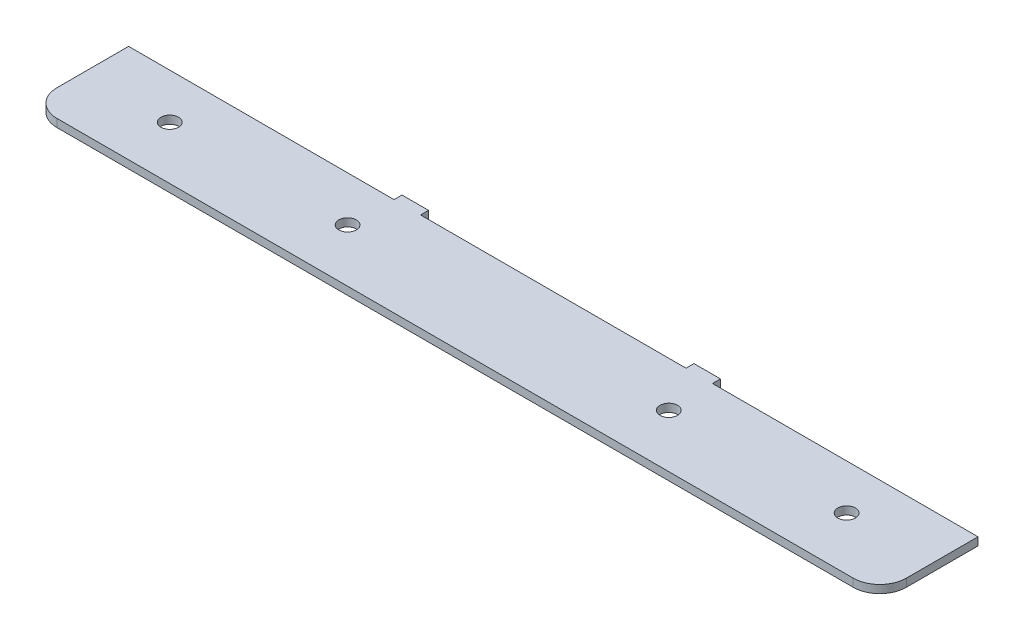
ISO-10303-21;
HEADER;
FILE_DESCRIPTION(('STEP AP214'),'2;1');
FILE_NAME('part.step','',(''),(''),'','','');
FILE_SCHEMA(('AUTOMOTIVE_DESIGN { 1 0 10303 214 1 1 1 1 }'));
ENDSEC;
DATA;
#1=APPLICATION_CONTEXT('core data for automotive mechanical design processes');
#2=APPLICATION_PROTOCOL_DEFINITION('international standard','automotive_design',2000,#1);
#3=PRODUCT_CONTEXT('',#1,'mechanical');
#4=PRODUCT('Part','Part','',(#3));
#5=PRODUCT_RELATED_PRODUCT_CATEGORY('part','',(#4));
#6=PRODUCT_DEFINITION_FORMATION('','',#4);
#7=PRODUCT_DEFINITION_CONTEXT('part definition',#1,'design');
#8=PRODUCT_DEFINITION('design','',#6,#7);
#9=PRODUCT_DEFINITION_SHAPE('','',#8);
#10=(LENGTH_UNIT() NAMED_UNIT(*) SI_UNIT(.MILLI.,.METRE.));
#11=(NAMED_UNIT(*) PLANE_ANGLE_UNIT() SI_UNIT($,.RADIAN.));
#12=(NAMED_UNIT(*) SI_UNIT($,.STERADIAN.) SOLID_ANGLE_UNIT());
#13=UNCERTAINTY_MEASURE_WITH_UNIT(LENGTH_MEASURE(1.E-05),#10,'distance_accuracy_value','');
#14=(GEOMETRIC_REPRESENTATION_CONTEXT(3) GLOBAL_UNCERTAINTY_ASSIGNED_CONTEXT((#13)) GLOBAL_UNIT_ASSIGNED_CONTEXT((#10,
#11,#12)) REPRESENTATION_CONTEXT('',''));
#15=CARTESIAN_POINT('',(0.,0.,0.));
#16=DIRECTION('',(0.,0.,1.));
#17=DIRECTION('',(1.,0.,0.));
#18=AXIS2_PLACEMENT_3D('',#15,#16,#17);
#19=CARTESIAN_POINT('',(-738.924593218809,901.500000000005,-669.000000000004));
#20=DIRECTION('',(0.,0.,1.));
#21=DIRECTION('',(1.,0.,0.));
#22=AXIS2_PLACEMENT_3D('',#19,#20,#21);
#23=PLANE('',#22);
#24=DIRECTION('',(-1.,0.,0.));
#25=VECTOR('',#24,1.);
#26=CARTESIAN_POINT('',(0.,898.5,-669.));
#27=LINE('',#26,#25);
#28=CARTESIAN_POINT('',(25.,898.5,-669.));
#29=VERTEX_POINT('',#28);
#30=CARTESIAN_POINT('',(-25.,898.5,-669.));
#31=VERTEX_POINT('',#30);
#32=EDGE_CURVE('E62',#29,#31,#27,.T.);
#33=ORIENTED_EDGE('',*,*,#32,.F.);
#34=DIRECTION('',(0.,-1.,0.));
#35=VECTOR('',#34,1.);
#36=CARTESIAN_POINT('',(25.,898.5,-669.));
#37=LINE('',#36,#35);
#38=CARTESIAN_POINT('',(25.,897.,-669.));
#39=VERTEX_POINT('',#38);
#40=EDGE_CURVE('E194',#29,#39,#37,.T.);
#41=ORIENTED_EDGE('',*,*,#40,.T.);
#42=DIRECTION('',(-1.,0.,0.));
#43=VECTOR('',#42,1.);
#44=CARTESIAN_POINT('',(0.,897.,-669.000000000004));
#45=LINE('',#44,#43);
#46=CARTESIAN_POINT('',(-25.,897.,-669.));
#47=VERTEX_POINT('',#46);
#48=EDGE_CURVE('E50',#39,#47,#45,.T.);
#49=ORIENTED_EDGE('',*,*,#48,.T.);
#50=DIRECTION('',(0.,-1.,0.));
#51=VECTOR('',#50,1.);
#52=CARTESIAN_POINT('',(-25.,898.5,-669.));
#53=LINE('',#52,#51);
#54=EDGE_CURVE('E230',#31,#47,#53,.T.);
#55=ORIENTED_EDGE('',*,*,#54,.F.);
#56=EDGE_LOOP('',(#33,#41,#49,#55));
#57=FACE_BOUND('',#56,.T.);
#58=ADVANCED_FACE('F42',(#57),#23,.F.);
#59=CARTESIAN_POINT('',(80.,897.,-669.));
#60=VERTEX_POINT('',#59);
#61=CARTESIAN_POINT('',(30.,897.,-669.000000000004));
#62=VERTEX_POINT('',#61);
#63=EDGE_CURVE('E11',#60,#62,#45,.T.);
#64=ORIENTED_EDGE('',*,*,#63,.T.);
#65=DIRECTION('',(0.,-1.,0.));
#66=VECTOR('',#65,1.);
#67=CARTESIAN_POINT('',(30.,898.5,-669.));
#68=LINE('',#67,#66);
#69=CARTESIAN_POINT('',(30.,898.5,-669.));
#70=VERTEX_POINT('',#69);
#71=EDGE_CURVE('E72',#70,#62,#68,.T.);
#72=ORIENTED_EDGE('',*,*,#71,.F.);
#73=CARTESIAN_POINT('',(80.,898.5,-669.));
#74=VERTEX_POINT('',#73);
#75=EDGE_CURVE('E236',#74,#70,#27,.T.);
#76=ORIENTED_EDGE('',*,*,#75,.F.);
#77=DIRECTION('',(0.,1.,0.));
#78=VECTOR('',#77,1.);
#79=CARTESIAN_POINT('',(80.,0.,-669.));
#80=LINE('',#79,#78);
#81=EDGE_CURVE('E282',#60,#74,#80,.T.);
#82=ORIENTED_EDGE('',*,*,#81,.F.);
#83=EDGE_LOOP('',(#64,#72,#76,#82));
#84=FACE_BOUND('',#83,.T.);
#85=ADVANCED_FACE('F351',(#84),#23,.F.);
#86=CARTESIAN_POINT('',(-30.,898.5,-669.));
#87=VERTEX_POINT('',#86);
#88=CARTESIAN_POINT('',(-80.,898.5,-669.));
#89=VERTEX_POINT('',#88);
#90=EDGE_CURVE('E239',#87,#89,#27,.T.);
#91=ORIENTED_EDGE('',*,*,#90,.F.);
#92=DIRECTION('',(0.,-1.,0.));
#93=VECTOR('',#92,1.);
#94=CARTESIAN_POINT('',(-30.,898.5,-669.));
#95=LINE('',#94,#93);
#96=CARTESIAN_POINT('',(-30.,897.,-669.000000000004));
#97=VERTEX_POINT('',#96);
#98=EDGE_CURVE('E226',#87,#97,#95,.T.);
#99=ORIENTED_EDGE('',*,*,#98,.T.);
#100=CARTESIAN_POINT('',(-80.,897.,-669.));
#101=VERTEX_POINT('',#100);
#102=EDGE_CURVE('E51',#97,#101,#45,.T.);
#103=ORIENTED_EDGE('',*,*,#102,.T.);
#104=DIRECTION('',(0.,1.,0.));
#105=VECTOR('',#104,1.);
#106=CARTESIAN_POINT('',(-80.,0.,-669.));
#107=LINE('',#106,#105);
#108=EDGE_CURVE('E229',#89,#101,#107,.F.);
#109=ORIENTED_EDGE('',*,*,#108,.F.);
#110=EDGE_LOOP('',(#91,#99,#103,#109));
#111=FACE_BOUND('',#110,.T.);
#112=ADVANCED_FACE('F44',(#111),#23,.F.);
#113=CARTESIAN_POINT('',(-75.,897.,-655.5));
#114=DIRECTION('',(0.,1.,0.));
#115=DIRECTION('',(0.,0.,1.));
#116=AXIS2_PLACEMENT_3D('',#113,#114,#115);
#117=CYLINDRICAL_SURFACE('',#116,5.);
#118=CARTESIAN_POINT('',(-75.,897.,-655.5));
#119=DIRECTION('',(0.,1.,0.));
#120=DIRECTION('',(0.,0.,1.));
#121=AXIS2_PLACEMENT_3D('',#118,#119,#120);
#122=CIRCLE('',#121,5.);
#123=CARTESIAN_POINT('',(-75.,897.,-650.5));
#124=VERTEX_POINT('',#123);
#125=CARTESIAN_POINT('',(-80.,897.,-655.5));
#126=VERTEX_POINT('',#125);
#127=EDGE_CURVE('E261',#124,#126,#122,.F.);
#128=ORIENTED_EDGE('',*,*,#127,.F.);
#129=DIRECTION('',(0.,1.,0.));
#130=VECTOR('',#129,1.);
#131=CARTESIAN_POINT('',(-75.,897.,-650.5));
#132=LINE('',#131,#130);
#133=CARTESIAN_POINT('',(-75.,898.5,-650.5));
#134=VERTEX_POINT('',#133);
#135=EDGE_CURVE('E243',#124,#134,#132,.T.);
#136=ORIENTED_EDGE('',*,*,#135,.T.);
#137=CARTESIAN_POINT('',(-75.,898.5,-655.5));
#138=DIRECTION('',(0.,1.,0.));
#139=DIRECTION('',(0.,0.,1.));
#140=AXIS2_PLACEMENT_3D('',#137,#138,#139);
#141=CIRCLE('',#140,5.);
#142=CARTESIAN_POINT('',(-80.,898.5,-655.5));
#143=VERTEX_POINT('',#142);
#144=EDGE_CURVE('E240',#134,#143,#141,.F.);
#145=ORIENTED_EDGE('',*,*,#144,.T.);
#146=DIRECTION('',(0.,1.,0.));
#147=VECTOR('',#146,1.);
#148=CARTESIAN_POINT('',(-80.,899.2366,-655.5));
#149=LINE('',#148,#147);
#150=EDGE_CURVE('E287',#126,#143,#149,.T.);
#151=ORIENTED_EDGE('',*,*,#150,.F.);
#152=EDGE_LOOP('',(#128,#136,#145,#151));
#153=FACE_BOUND('',#152,.T.);
#154=ADVANCED_FACE('F323',(#153),#117,.T.);
#155=CARTESIAN_POINT('',(80.,897.,-650.5));
#156=DIRECTION('',(0.,0.,1.));
#157=DIRECTION('',(0.,-1.,0.));
#158=AXIS2_PLACEMENT_3D('',#155,#156,#157);
#159=PLANE('',#158);
#160=DIRECTION('',(1.,0.,0.));
#161=VECTOR('',#160,1.);
#162=CARTESIAN_POINT('',(80.,898.5,-650.5));
#163=LINE('',#162,#161);
#164=CARTESIAN_POINT('',(75.,898.5,-650.5));
#165=VERTEX_POINT('',#164);
#166=EDGE_CURVE('E242',#165,#134,#163,.F.);
#167=ORIENTED_EDGE('',*,*,#166,.T.);
#168=ORIENTED_EDGE('',*,*,#135,.F.);
#169=DIRECTION('',(1.,0.,0.));
#170=VECTOR('',#169,1.);
#171=CARTESIAN_POINT('',(0.,897.,-650.5));
#172=LINE('',#171,#170);
#173=CARTESIAN_POINT('',(75.,897.,-650.5));
#174=VERTEX_POINT('',#173);
#175=EDGE_CURVE('E264',#174,#124,#172,.F.);
#176=ORIENTED_EDGE('',*,*,#175,.F.);
#177=DIRECTION('',(0.,1.,0.));
#178=VECTOR('',#177,1.);
#179=CARTESIAN_POINT('',(75.,897.,-650.5));
#180=LINE('',#179,#178);
#181=EDGE_CURVE('E247',#165,#174,#180,.F.);
#182=ORIENTED_EDGE('',*,*,#181,.F.);
#183=EDGE_LOOP('',(#167,#168,#176,#182));
#184=FACE_BOUND('',#183,.T.);
#185=ADVANCED_FACE('F318',(#184),#159,.T.);
#186=CARTESIAN_POINT('',(75.,897.,-655.5));
#187=DIRECTION('',(0.,1.,0.));
#188=DIRECTION('',(0.,0.,1.));
#189=AXIS2_PLACEMENT_3D('',#186,#187,#188);
#190=CYLINDRICAL_SURFACE('',#189,5.);
#191=CARTESIAN_POINT('',(75.,897.,-655.5));
#192=DIRECTION('',(0.,1.,0.));
#193=DIRECTION('',(0.,0.,1.));
#194=AXIS2_PLACEMENT_3D('',#191,#192,#193);
#195=CIRCLE('',#194,5.);
#196=CARTESIAN_POINT('',(80.,897.,-655.5));
#197=VERTEX_POINT('',#196);
#198=EDGE_CURVE('E266',#197,#174,#195,.F.);
#199=ORIENTED_EDGE('',*,*,#198,.F.);
#200=DIRECTION('',(0.,1.,0.));
#201=VECTOR('',#200,1.);
#202=CARTESIAN_POINT('',(80.,899.2366,-655.5));
#203=LINE('',#202,#201);
#204=CARTESIAN_POINT('',(80.,898.5,-655.5));
#205=VERTEX_POINT('',#204);
#206=EDGE_CURVE('E238',#197,#205,#203,.T.);
#207=ORIENTED_EDGE('',*,*,#206,.T.);
#208=CARTESIAN_POINT('',(75.,898.5,-655.5));
#209=DIRECTION('',(0.,1.,0.));
#210=DIRECTION('',(0.,0.,1.));
#211=AXIS2_PLACEMENT_3D('',#208,#209,#210);
#212=CIRCLE('',#211,5.);
#213=EDGE_CURVE('E244',#205,#165,#212,.F.);
#214=ORIENTED_EDGE('',*,*,#213,.T.);
#215=ORIENTED_EDGE('',*,*,#181,.T.);
#216=EDGE_LOOP('',(#199,#207,#214,#215));
#217=FACE_BOUND('',#216,.T.);
#218=ADVANCED_FACE('F315',(#217),#190,.T.);
#219=CARTESIAN_POINT('',(30.25,897.,-660.5));
#220=DIRECTION('',(0.,-1.,0.));
#221=DIRECTION('',(0.,0.,-1.));
#222=AXIS2_PLACEMENT_3D('',#219,#220,#221);
#223=CYLINDRICAL_SURFACE('',#222,1.65000000000004);
#224=CARTESIAN_POINT('',(30.25,898.5,-660.5));
#225=DIRECTION('',(0.,-1.,0.));
#226=DIRECTION('',(0.,0.,-1.));
#227=AXIS2_PLACEMENT_3D('',#224,#225,#226);
#228=CIRCLE('',#227,1.65000000000004);
#229=CARTESIAN_POINT('',(30.25,898.5,-662.15));
#230=VERTEX_POINT('',#229);
#231=EDGE_CURVE('E248',#230,#230,#228,.T.);
#232=ORIENTED_EDGE('',*,*,#231,.F.);
#233=EDGE_LOOP('',(#232));
#234=FACE_BOUND('',#233,.T.);
#235=CARTESIAN_POINT('',(30.25,897.,-660.5));
#236=DIRECTION('',(0.,-1.,0.));
#237=DIRECTION('',(0.,0.,-1.));
#238=AXIS2_PLACEMENT_3D('',#235,#236,#237);
#239=CIRCLE('',#238,1.65000000000004);
#240=CARTESIAN_POINT('',(30.25,897.,-662.15));
#241=VERTEX_POINT('',#240);
#242=EDGE_CURVE('E270',#241,#241,#239,.F.);
#243=ORIENTED_EDGE('',*,*,#242,.F.);
#244=EDGE_LOOP('',(#243));
#245=FACE_BOUND('',#244,.T.);
#246=ADVANCED_FACE('F368',(#234,#245),#223,.F.);
#247=CARTESIAN_POINT('',(63.75,897.,-660.5));
#248=DIRECTION('',(0.,-1.,0.));
#249=DIRECTION('',(0.,0.,-1.));
#250=AXIS2_PLACEMENT_3D('',#247,#248,#249);
#251=CYLINDRICAL_SURFACE('',#250,1.64999999999993);
#252=CARTESIAN_POINT('',(63.75,898.5,-660.5));
#253=DIRECTION('',(0.,-1.,0.));
#254=DIRECTION('',(0.,0.,-1.));
#255=AXIS2_PLACEMENT_3D('',#252,#253,#254);
#256=CIRCLE('',#255,1.64999999999993);
#257=CARTESIAN_POINT('',(63.75,898.5,-662.15));
#258=VERTEX_POINT('',#257);
#259=EDGE_CURVE('E251',#258,#258,#256,.T.);
#260=ORIENTED_EDGE('',*,*,#259,.F.);
#261=EDGE_LOOP('',(#260));
#262=FACE_BOUND('',#261,.T.);
#263=CARTESIAN_POINT('',(63.75,897.,-660.5));
#264=DIRECTION('',(0.,-1.,0.));
#265=DIRECTION('',(0.,0.,-1.));
#266=AXIS2_PLACEMENT_3D('',#263,#264,#265);
#267=CIRCLE('',#266,1.64999999999993);
#268=CARTESIAN_POINT('',(63.75,897.,-662.15));
#269=VERTEX_POINT('',#268);
#270=EDGE_CURVE('E273',#269,#269,#267,.F.);
#271=ORIENTED_EDGE('',*,*,#270,.F.);
#272=EDGE_LOOP('',(#271));
#273=FACE_BOUND('',#272,.T.);
#274=ADVANCED_FACE('F371',(#262,#273),#251,.F.);
#275=CARTESIAN_POINT('',(-30.25,897.,-660.5));
#276=DIRECTION('',(0.,-1.,0.));
#277=DIRECTION('',(0.,0.,-1.));
#278=AXIS2_PLACEMENT_3D('',#275,#276,#277);
#279=CYLINDRICAL_SURFACE('',#278,1.65000000000004);
#280=CARTESIAN_POINT('',(-30.25,898.5,-660.5));
#281=DIRECTION('',(0.,-1.,0.));
#282=DIRECTION('',(0.,0.,-1.));
#283=AXIS2_PLACEMENT_3D('',#280,#281,#282);
#284=CIRCLE('',#283,1.65000000000004);
#285=CARTESIAN_POINT('',(-30.25,898.5,-662.15));
#286=VERTEX_POINT('',#285);
#287=EDGE_CURVE('E254',#286,#286,#284,.T.);
#288=ORIENTED_EDGE('',*,*,#287,.F.);
#289=EDGE_LOOP('',(#288));
#290=FACE_BOUND('',#289,.T.);
#291=CARTESIAN_POINT('',(-30.25,897.,-660.5));
#292=DIRECTION('',(0.,-1.,0.));
#293=DIRECTION('',(0.,0.,-1.));
#294=AXIS2_PLACEMENT_3D('',#291,#292,#293);
#295=CIRCLE('',#294,1.65000000000004);
#296=CARTESIAN_POINT('',(-30.25,897.,-662.15));
#297=VERTEX_POINT('',#296);
#298=EDGE_CURVE('E276',#297,#297,#295,.F.);
#299=ORIENTED_EDGE('',*,*,#298,.F.);
#300=EDGE_LOOP('',(#299));
#301=FACE_BOUND('',#300,.T.);
#302=ADVANCED_FACE('F375',(#290,#301),#279,.F.);
#303=CARTESIAN_POINT('',(-63.75,897.,-660.5));
#304=DIRECTION('',(0.,-1.,0.));
#305=DIRECTION('',(0.,0.,-1.));
#306=AXIS2_PLACEMENT_3D('',#303,#304,#305);
#307=CYLINDRICAL_SURFACE('',#306,1.65000000000004);
#308=CARTESIAN_POINT('',(-63.75,898.5,-660.5));
#309=DIRECTION('',(0.,-1.,0.));
#310=DIRECTION('',(0.,0.,-1.));
#311=AXIS2_PLACEMENT_3D('',#308,#309,#310);
#312=CIRCLE('',#311,1.65000000000004);
#313=CARTESIAN_POINT('',(-63.75,898.5,-662.15));
#314=VERTEX_POINT('',#313);
#315=EDGE_CURVE('E257',#314,#314,#312,.T.);
#316=ORIENTED_EDGE('',*,*,#315,.F.);
#317=EDGE_LOOP('',(#316));
#318=FACE_BOUND('',#317,.T.);
#319=CARTESIAN_POINT('',(-63.75,897.,-660.5));
#320=DIRECTION('',(0.,-1.,0.));
#321=DIRECTION('',(0.,0.,-1.));
#322=AXIS2_PLACEMENT_3D('',#319,#320,#321);
#323=CIRCLE('',#322,1.65000000000004);
#324=CARTESIAN_POINT('',(-63.75,897.,-662.15));
#325=VERTEX_POINT('',#324);
#326=EDGE_CURVE('E279',#325,#325,#323,.F.);
#327=ORIENTED_EDGE('',*,*,#326,.F.);
#328=EDGE_LOOP('',(#327));
#329=FACE_BOUND('',#328,.T.);
#330=ADVANCED_FACE('F379',(#318,#329),#307,.F.);
#331=CARTESIAN_POINT('',(80.,899.2366,-668.2634));
#332=DIRECTION('',(-1.,0.,0.));
#333=DIRECTION('',(0.,0.,1.));
#334=AXIS2_PLACEMENT_3D('',#331,#332,#333);
#335=PLANE('',#334);
#336=DIRECTION('',(0.,0.,-1.));
#337=VECTOR('',#336,1.);
#338=CARTESIAN_POINT('',(80.,896.999999999996,5.44009282066327E-12));
#339=LINE('',#338,#337);
#340=EDGE_CURVE('E269',#60,#197,#339,.F.);
#341=ORIENTED_EDGE('',*,*,#340,.F.);
#342=ORIENTED_EDGE('',*,*,#81,.T.);
#343=DIRECTION('',(0.,0.,1.));
#344=VECTOR('',#343,1.);
#345=CARTESIAN_POINT('',(80.,898.5,-668.2634));
#346=LINE('',#345,#344);
#347=EDGE_CURVE('E260',#205,#74,#346,.F.);
#348=ORIENTED_EDGE('',*,*,#347,.F.);
#349=ORIENTED_EDGE('',*,*,#206,.F.);
#350=EDGE_LOOP('',(#341,#342,#348,#349));
#351=FACE_BOUND('',#350,.T.);
#352=ADVANCED_FACE('F312',(#351),#335,.F.);
#353=CARTESIAN_POINT('',(0.,898.499999999996,5.44009282066327E-12));
#354=DIRECTION('',(0.,-1.,0.));
#355=DIRECTION('',(0.,0.,-1.));
#356=AXIS2_PLACEMENT_3D('',#353,#354,#355);
#357=PLANE('',#356);
#358=ORIENTED_EDGE('',*,*,#315,.T.);
#359=EDGE_LOOP('',(#358));
#360=FACE_BOUND('',#359,.T.);
#361=ORIENTED_EDGE('',*,*,#287,.T.);
#362=EDGE_LOOP('',(#361));
#363=FACE_BOUND('',#362,.T.);
#364=ORIENTED_EDGE('',*,*,#259,.T.);
#365=EDGE_LOOP('',(#364));
#366=FACE_BOUND('',#365,.T.);
#367=ORIENTED_EDGE('',*,*,#231,.T.);
#368=EDGE_LOOP('',(#367));
#369=FACE_BOUND('',#368,.T.);
#370=ORIENTED_EDGE('',*,*,#347,.T.);
#371=ORIENTED_EDGE('',*,*,#75,.T.);
#372=DIRECTION('',(0.,0.,1.));
#373=VECTOR('',#372,1.);
#374=CARTESIAN_POINT('',(30.,898.5,-669.));
#375=LINE('',#374,#373);
#376=CARTESIAN_POINT('',(30.,898.5,-670.5));
#377=VERTEX_POINT('',#376);
#378=EDGE_CURVE('E183',#377,#70,#375,.T.);
#379=ORIENTED_EDGE('',*,*,#378,.F.);
#380=DIRECTION('',(1.,0.,0.));
#381=VECTOR('',#380,1.);
#382=CARTESIAN_POINT('',(25.,898.5,-670.5));
#383=LINE('',#382,#381);
#384=CARTESIAN_POINT('',(25.,898.5,-670.5));
#385=VERTEX_POINT('',#384);
#386=EDGE_CURVE('E175',#385,#377,#383,.T.);
#387=ORIENTED_EDGE('',*,*,#386,.F.);
#388=DIRECTION('',(0.,0.,-1.));
#389=VECTOR('',#388,1.);
#390=CARTESIAN_POINT('',(25.,898.5,-669.));
#391=LINE('',#390,#389);
#392=EDGE_CURVE('E190',#29,#385,#391,.T.);
#393=ORIENTED_EDGE('',*,*,#392,.F.);
#394=ORIENTED_EDGE('',*,*,#32,.T.);
#395=DIRECTION('',(0.,0.,1.));
#396=VECTOR('',#395,1.);
#397=CARTESIAN_POINT('',(-25.,898.5,-669.));
#398=LINE('',#397,#396);
#399=CARTESIAN_POINT('',(-25.,898.5,-670.5));
#400=VERTEX_POINT('',#399);
#401=EDGE_CURVE('E215',#400,#31,#398,.T.);
#402=ORIENTED_EDGE('',*,*,#401,.F.);
#403=DIRECTION('',(1.,0.,0.));
#404=VECTOR('',#403,1.);
#405=CARTESIAN_POINT('',(-30.,898.5,-670.5));
#406=LINE('',#405,#404);
#407=CARTESIAN_POINT('',(-30.,898.5,-670.5));
#408=VERTEX_POINT('',#407);
#409=EDGE_CURVE('E211',#408,#400,#406,.T.);
#410=ORIENTED_EDGE('',*,*,#409,.F.);
#411=DIRECTION('',(0.,0.,-1.));
#412=VECTOR('',#411,1.);
#413=CARTESIAN_POINT('',(-30.,898.5,-669.));
#414=LINE('',#413,#412);
#415=EDGE_CURVE('E208',#87,#408,#414,.T.);
#416=ORIENTED_EDGE('',*,*,#415,.F.);
#417=ORIENTED_EDGE('',*,*,#90,.T.);
#418=DIRECTION('',(0.,0.,1.));
#419=VECTOR('',#418,1.);
#420=CARTESIAN_POINT('',(-80.,898.5,-668.2634));
#421=LINE('',#420,#419);
#422=EDGE_CURVE('E290',#143,#89,#421,.F.);
#423=ORIENTED_EDGE('',*,*,#422,.F.);
#424=ORIENTED_EDGE('',*,*,#144,.F.);
#425=ORIENTED_EDGE('',*,*,#166,.F.);
#426=ORIENTED_EDGE('',*,*,#213,.F.);
#427=EDGE_LOOP('',(#370,#371,#379,#387,#393,#394,#402,#410,#416,#417,#423,#424,#425,#426));
#428=FACE_BOUND('',#427,.T.);
#429=ADVANCED_FACE('F189',(#360,#363,#366,#369,#428),#357,.F.);
#430=CARTESIAN_POINT('',(-80.,899.2366,-668.2634));
#431=DIRECTION('',(-1.,0.,0.));
#432=DIRECTION('',(0.,0.,1.));
#433=AXIS2_PLACEMENT_3D('',#430,#431,#432);
#434=PLANE('',#433);
#435=ORIENTED_EDGE('',*,*,#108,.T.);
#436=DIRECTION('',(0.,0.,-1.));
#437=VECTOR('',#436,1.);
#438=CARTESIAN_POINT('',(-80.,896.999999999996,5.44009282066327E-12));
#439=LINE('',#438,#437);
#440=EDGE_CURVE('E265',#126,#101,#439,.T.);
#441=ORIENTED_EDGE('',*,*,#440,.F.);
#442=ORIENTED_EDGE('',*,*,#150,.T.);
#443=ORIENTED_EDGE('',*,*,#422,.T.);
#444=EDGE_LOOP('',(#435,#441,#442,#443));
#445=FACE_BOUND('',#444,.T.);
#446=ADVANCED_FACE('F326',(#445),#434,.T.);
#447=CARTESIAN_POINT('',(0.,896.999999999996,5.44009282066327E-12));
#448=DIRECTION('',(0.,-1.,0.));
#449=DIRECTION('',(0.,0.,-1.));
#450=AXIS2_PLACEMENT_3D('',#447,#448,#449);
#451=PLANE('',#450);
#452=ORIENTED_EDGE('',*,*,#63,.F.);
#453=ORIENTED_EDGE('',*,*,#340,.T.);
#454=ORIENTED_EDGE('',*,*,#198,.T.);
#455=ORIENTED_EDGE('',*,*,#175,.T.);
#456=ORIENTED_EDGE('',*,*,#127,.T.);
#457=ORIENTED_EDGE('',*,*,#440,.T.);
#458=ORIENTED_EDGE('',*,*,#102,.F.);
#459=DIRECTION('',(0.,0.,-1.));
#460=VECTOR('',#459,1.);
#461=CARTESIAN_POINT('',(-30.,897.,-669.));
#462=LINE('',#461,#460);
#463=CARTESIAN_POINT('',(-30.,897.,-670.5));
#464=VERTEX_POINT('',#463);
#465=EDGE_CURVE('E205',#97,#464,#462,.T.);
#466=ORIENTED_EDGE('',*,*,#465,.T.);
#467=DIRECTION('',(1.,0.,0.));
#468=VECTOR('',#467,1.);
#469=CARTESIAN_POINT('',(-30.,897.,-670.5));
#470=LINE('',#469,#468);
#471=CARTESIAN_POINT('',(-25.,897.,-670.5));
#472=VERTEX_POINT('',#471);
#473=EDGE_CURVE('E221',#464,#472,#470,.T.);
#474=ORIENTED_EDGE('',*,*,#473,.T.);
#475=DIRECTION('',(0.,0.,1.));
#476=VECTOR('',#475,1.);
#477=CARTESIAN_POINT('',(-25.,897.,-669.));
#478=LINE('',#477,#476);
#479=EDGE_CURVE('E212',#472,#47,#478,.T.);
#480=ORIENTED_EDGE('',*,*,#479,.T.);
#481=ORIENTED_EDGE('',*,*,#48,.F.);
#482=DIRECTION('',(0.,0.,-1.));
#483=VECTOR('',#482,1.);
#484=CARTESIAN_POINT('',(25.,897.,-669.));
#485=LINE('',#484,#483);
#486=CARTESIAN_POINT('',(25.,897.,-670.5));
#487=VERTEX_POINT('',#486);
#488=EDGE_CURVE('E201',#39,#487,#485,.T.);
#489=ORIENTED_EDGE('',*,*,#488,.T.);
#490=DIRECTION('',(1.,0.,0.));
#491=VECTOR('',#490,1.);
#492=CARTESIAN_POINT('',(25.,897.,-670.5));
#493=LINE('',#492,#491);
#494=CARTESIAN_POINT('',(30.,897.,-670.5));
#495=VERTEX_POINT('',#494);
#496=EDGE_CURVE('E177',#487,#495,#493,.T.);
#497=ORIENTED_EDGE('',*,*,#496,.T.);
#498=DIRECTION('',(0.,0.,1.));
#499=VECTOR('',#498,1.);
#500=CARTESIAN_POINT('',(30.,897.,-669.));
#501=LINE('',#500,#499);
#502=EDGE_CURVE('E195',#495,#62,#501,.T.);
#503=ORIENTED_EDGE('',*,*,#502,.T.);
#504=EDGE_LOOP('',(#452,#453,#454,#455,#456,#457,#458,#466,#474,#480,#481,#489,#497,#503));
#505=FACE_BOUND('',#504,.T.);
#506=ORIENTED_EDGE('',*,*,#326,.T.);
#507=EDGE_LOOP('',(#506));
#508=FACE_BOUND('',#507,.T.);
#509=ORIENTED_EDGE('',*,*,#298,.T.);
#510=EDGE_LOOP('',(#509));
#511=FACE_BOUND('',#510,.T.);
#512=ORIENTED_EDGE('',*,*,#270,.T.);
#513=EDGE_LOOP('',(#512));
#514=FACE_BOUND('',#513,.T.);
#515=ORIENTED_EDGE('',*,*,#242,.T.);
#516=EDGE_LOOP('',(#515));
#517=FACE_BOUND('',#516,.T.);
#518=ADVANCED_FACE('F308',(#505,#508,#511,#514,#517),#451,.T.);
#519=CARTESIAN_POINT('',(-30.,898.5,-669.));
#520=DIRECTION('',(-1.,0.,0.));
#521=DIRECTION('',(0.,0.,1.));
#522=AXIS2_PLACEMENT_3D('',#519,#520,#521);
#523=PLANE('',#522);
#524=ORIENTED_EDGE('',*,*,#465,.F.);
#525=ORIENTED_EDGE('',*,*,#98,.F.);
#526=ORIENTED_EDGE('',*,*,#415,.T.);
#527=DIRECTION('',(0.,-1.,0.));
#528=VECTOR('',#527,1.);
#529=CARTESIAN_POINT('',(-30.,898.5,-670.5));
#530=LINE('',#529,#528);
#531=EDGE_CURVE('E218',#408,#464,#530,.T.);
#532=ORIENTED_EDGE('',*,*,#531,.T.);
#533=EDGE_LOOP('',(#524,#525,#526,#532));
#534=FACE_BOUND('',#533,.T.);
#535=ADVANCED_FACE('F340',(#534),#523,.T.);
#536=CARTESIAN_POINT('',(-25.,898.5,-669.));
#537=DIRECTION('',(1.,0.,0.));
#538=DIRECTION('',(0.,0.,-1.));
#539=AXIS2_PLACEMENT_3D('',#536,#537,#538);
#540=PLANE('',#539);
#541=ORIENTED_EDGE('',*,*,#479,.F.);
#542=DIRECTION('',(0.,-1.,0.));
#543=VECTOR('',#542,1.);
#544=CARTESIAN_POINT('',(-25.,898.5,-670.5));
#545=LINE('',#544,#543);
#546=EDGE_CURVE('E233',#400,#472,#545,.T.);
#547=ORIENTED_EDGE('',*,*,#546,.F.);
#548=ORIENTED_EDGE('',*,*,#401,.T.);
#549=ORIENTED_EDGE('',*,*,#54,.T.);
#550=EDGE_LOOP('',(#541,#547,#548,#549));
#551=FACE_BOUND('',#550,.T.);
#552=ADVANCED_FACE('F332',(#551),#540,.T.);
#553=CARTESIAN_POINT('',(-30.,898.5,-670.5));
#554=DIRECTION('',(0.,0.,-1.));
#555=DIRECTION('',(0.,1.,0.));
#556=AXIS2_PLACEMENT_3D('',#553,#554,#555);
#557=PLANE('',#556);
#558=ORIENTED_EDGE('',*,*,#473,.F.);
#559=ORIENTED_EDGE('',*,*,#531,.F.);
#560=ORIENTED_EDGE('',*,*,#409,.T.);
#561=ORIENTED_EDGE('',*,*,#546,.T.);
#562=EDGE_LOOP('',(#558,#559,#560,#561));
#563=FACE_BOUND('',#562,.T.);
#564=ADVANCED_FACE('F336',(#563),#557,.T.);
#565=CARTESIAN_POINT('',(25.,898.5,-669.));
#566=DIRECTION('',(-1.,0.,0.));
#567=DIRECTION('',(0.,0.,1.));
#568=AXIS2_PLACEMENT_3D('',#565,#566,#567);
#569=PLANE('',#568);
#570=ORIENTED_EDGE('',*,*,#488,.F.);
#571=ORIENTED_EDGE('',*,*,#40,.F.);
#572=ORIENTED_EDGE('',*,*,#392,.T.);
#573=DIRECTION('',(0.,-1.,0.));
#574=VECTOR('',#573,1.);
#575=CARTESIAN_POINT('',(25.,898.5,-670.5));
#576=LINE('',#575,#574);
#577=EDGE_CURVE('E172',#385,#487,#576,.T.);
#578=ORIENTED_EDGE('',*,*,#577,.T.);
#579=EDGE_LOOP('',(#570,#571,#572,#578));
#580=FACE_BOUND('',#579,.T.);
#581=ADVANCED_FACE('F193',(#580),#569,.T.);
#582=CARTESIAN_POINT('',(30.,898.5,-669.));
#583=DIRECTION('',(1.,0.,0.));
#584=DIRECTION('',(0.,0.,-1.));
#585=AXIS2_PLACEMENT_3D('',#582,#583,#584);
#586=PLANE('',#585);
#587=ORIENTED_EDGE('',*,*,#502,.F.);
#588=DIRECTION('',(0.,-1.,0.));
#589=VECTOR('',#588,1.);
#590=CARTESIAN_POINT('',(30.,898.5,-670.5));
#591=LINE('',#590,#589);
#592=EDGE_CURVE('E182',#377,#495,#591,.T.);
#593=ORIENTED_EDGE('',*,*,#592,.F.);
#594=ORIENTED_EDGE('',*,*,#378,.T.);
#595=ORIENTED_EDGE('',*,*,#71,.T.);
#596=EDGE_LOOP('',(#587,#593,#594,#595));
#597=FACE_BOUND('',#596,.T.);
#598=ADVANCED_FACE('F484',(#597),#586,.T.);
#599=CARTESIAN_POINT('',(25.,898.5,-670.5));
#600=DIRECTION('',(0.,0.,-1.));
#601=DIRECTION('',(0.,1.,0.));
#602=AXIS2_PLACEMENT_3D('',#599,#600,#601);
#603=PLANE('',#602);
#604=ORIENTED_EDGE('',*,*,#496,.F.);
#605=ORIENTED_EDGE('',*,*,#577,.F.);
#606=ORIENTED_EDGE('',*,*,#386,.T.);
#607=ORIENTED_EDGE('',*,*,#592,.T.);
#608=EDGE_LOOP('',(#604,#605,#606,#607));
#609=FACE_BOUND('',#608,.T.);
#610=ADVANCED_FACE('F174',(#609),#603,.T.);
#611=CLOSED_SHELL('',(#58,#85,#112,#154,#185,#218,#246,#274,#302,#330,#352,#429,#446,#518,#535,
#552,#564,#581,#598,#610));
#612=MANIFOLD_SOLID_BREP('B2',#611);
#613=ADVANCED_BREP_SHAPE_REPRESENTATION('',(#18,#612),#14);
#614=SHAPE_DEFINITION_REPRESENTATION(#9,#613);
ENDSEC;
END-ISO-10303-21;
